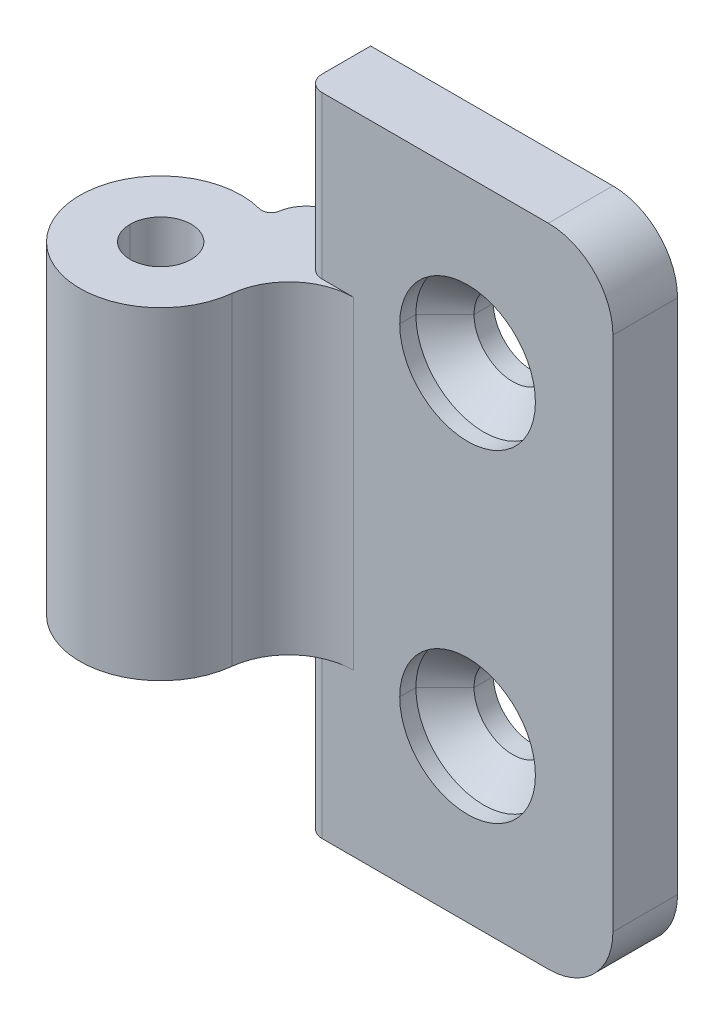
ISO-10303-21;
HEADER;
FILE_DESCRIPTION(('STEP AP214'),'2;1');
FILE_NAME('part.step','',(''),(''),'','','');
FILE_SCHEMA(('AUTOMOTIVE_DESIGN { 1 0 10303 214 1 1 1 1 }'));
ENDSEC;
DATA;
#1=APPLICATION_CONTEXT('core data for automotive mechanical design processes');
#2=APPLICATION_PROTOCOL_DEFINITION('international standard','automotive_design',2000,#1);
#3=PRODUCT_CONTEXT('',#1,'mechanical');
#4=PRODUCT('Part','Part','',(#3));
#5=PRODUCT_RELATED_PRODUCT_CATEGORY('part','',(#4));
#6=PRODUCT_DEFINITION_FORMATION('','',#4);
#7=PRODUCT_DEFINITION_CONTEXT('part definition',#1,'design');
#8=PRODUCT_DEFINITION('design','',#6,#7);
#9=PRODUCT_DEFINITION_SHAPE('','',#8);
#10=(LENGTH_UNIT() NAMED_UNIT(*) SI_UNIT(.MILLI.,.METRE.));
#11=(NAMED_UNIT(*) PLANE_ANGLE_UNIT() SI_UNIT($,.RADIAN.));
#12=(NAMED_UNIT(*) SI_UNIT($,.STERADIAN.) SOLID_ANGLE_UNIT());
#13=UNCERTAINTY_MEASURE_WITH_UNIT(LENGTH_MEASURE(1.E-05),#10,'distance_accuracy_value','');
#14=(GEOMETRIC_REPRESENTATION_CONTEXT(3) GLOBAL_UNCERTAINTY_ASSIGNED_CONTEXT((#13)) GLOBAL_UNIT_ASSIGNED_CONTEXT((#10,
#11,#12)) REPRESENTATION_CONTEXT('',''));
#15=CARTESIAN_POINT('',(0.,0.,0.));
#16=DIRECTION('',(0.,0.,1.));
#17=DIRECTION('',(1.,0.,0.));
#18=AXIS2_PLACEMENT_3D('',#15,#16,#17);
#19=CARTESIAN_POINT('',(8.,-5.,0.));
#20=DIRECTION('',(0.,0.,1.));
#21=DIRECTION('',(1.,0.,0.));
#22=AXIS2_PLACEMENT_3D('',#19,#20,#21);
#23=CYLINDRICAL_SURFACE('',#22,1.2);
#24=DIRECTION('',(0.,0.,1.));
#25=VECTOR('',#24,1.);
#26=CARTESIAN_POINT('',(6.8,-5.,0.));
#27=LINE('',#26,#25);
#28=CARTESIAN_POINT('',(6.8,-5.,0.));
#29=VERTEX_POINT('',#28);
#30=CARTESIAN_POINT('',(6.8,-5.,0.600000000000045));
#31=VERTEX_POINT('',#30);
#32=EDGE_CURVE('E304',#29,#31,#27,.T.);
#33=ORIENTED_EDGE('',*,*,#32,.F.);
#34=CARTESIAN_POINT('',(8.,-5.,0.));
#35=DIRECTION('',(0.,0.,-1.));
#36=DIRECTION('',(1.,0.,0.));
#37=AXIS2_PLACEMENT_3D('',#34,#35,#36);
#38=CIRCLE('',#37,1.2);
#39=CARTESIAN_POINT('',(9.2,-5.,0.));
#40=VERTEX_POINT('',#39);
#41=EDGE_CURVE('E28',#29,#40,#38,.T.);
#42=ORIENTED_EDGE('',*,*,#41,.T.);
#43=DIRECTION('',(0.,0.,1.));
#44=VECTOR('',#43,1.);
#45=CARTESIAN_POINT('',(9.2,-5.,0.));
#46=LINE('',#45,#44);
#47=CARTESIAN_POINT('',(9.2,-5.,0.6));
#48=VERTEX_POINT('',#47);
#49=EDGE_CURVE('E308',#40,#48,#46,.T.);
#50=ORIENTED_EDGE('',*,*,#49,.T.);
#51=CARTESIAN_POINT('',(8.,-5.,0.600000000000045));
#52=DIRECTION('',(0.,0.,-1.));
#53=DIRECTION('',(1.,0.,0.));
#54=AXIS2_PLACEMENT_3D('',#51,#52,#53);
#55=CIRCLE('',#54,1.2);
#56=EDGE_CURVE('E537',#31,#48,#55,.T.);
#57=ORIENTED_EDGE('',*,*,#56,.F.);
#58=EDGE_LOOP('',(#33,#42,#50,#57));
#59=FACE_BOUND('',#58,.T.);
#60=ADVANCED_FACE('F17',(#59),#23,.F.);
#61=CARTESIAN_POINT('',(8.,5.,0.));
#62=DIRECTION('',(0.,0.,1.));
#63=DIRECTION('',(1.,0.,0.));
#64=AXIS2_PLACEMENT_3D('',#61,#62,#63);
#65=CYLINDRICAL_SURFACE('',#64,1.2);
#66=DIRECTION('',(0.,0.,1.));
#67=VECTOR('',#66,1.);
#68=CARTESIAN_POINT('',(6.8,5.,0.));
#69=LINE('',#68,#67);
#70=CARTESIAN_POINT('',(6.8,5.,0.));
#71=VERTEX_POINT('',#70);
#72=CARTESIAN_POINT('',(6.8,5.,0.600000000000045));
#73=VERTEX_POINT('',#72);
#74=EDGE_CURVE('E466',#71,#73,#69,.T.);
#75=ORIENTED_EDGE('',*,*,#74,.F.);
#76=CARTESIAN_POINT('',(8.,5.,0.));
#77=DIRECTION('',(0.,0.,-1.));
#78=DIRECTION('',(1.,0.,0.));
#79=AXIS2_PLACEMENT_3D('',#76,#77,#78);
#80=CIRCLE('',#79,1.2);
#81=CARTESIAN_POINT('',(9.2,5.,0.));
#82=VERTEX_POINT('',#81);
#83=EDGE_CURVE('E11',#71,#82,#80,.T.);
#84=ORIENTED_EDGE('',*,*,#83,.T.);
#85=DIRECTION('',(0.,0.,1.));
#86=VECTOR('',#85,1.);
#87=CARTESIAN_POINT('',(9.2,5.,0.));
#88=LINE('',#87,#86);
#89=CARTESIAN_POINT('',(9.2,5.,0.6));
#90=VERTEX_POINT('',#89);
#91=EDGE_CURVE('E504',#82,#90,#88,.T.);
#92=ORIENTED_EDGE('',*,*,#91,.T.);
#93=CARTESIAN_POINT('',(8.,5.,0.600000000000045));
#94=DIRECTION('',(0.,0.,-1.));
#95=DIRECTION('',(1.,0.,0.));
#96=AXIS2_PLACEMENT_3D('',#93,#94,#95);
#97=CIRCLE('',#96,1.2);
#98=EDGE_CURVE('E296',#73,#90,#97,.T.);
#99=ORIENTED_EDGE('',*,*,#98,.F.);
#100=EDGE_LOOP('',(#75,#84,#92,#99));
#101=FACE_BOUND('',#100,.T.);
#102=ADVANCED_FACE('F804',(#101),#65,.F.);
#103=CARTESIAN_POINT('',(2.,5.,1.));
#104=DIRECTION('',(0.,-1.,0.));
#105=DIRECTION('',(1.,0.,0.));
#106=AXIS2_PLACEMENT_3D('',#103,#104,#105);
#107=CYLINDRICAL_SURFACE('',#106,1.);
#108=CARTESIAN_POINT('',(2.,-5.,1.));
#109=DIRECTION('',(0.,-1.,0.));
#110=DIRECTION('',(1.,0.,0.));
#111=AXIS2_PLACEMENT_3D('',#108,#109,#110);
#112=CIRCLE('',#111,1.);
#113=CARTESIAN_POINT('',(1.01272907012124,-5.,0.840952486873575));
#114=VERTEX_POINT('',#113);
#115=CARTESIAN_POINT('',(2.,-5.,0.));
#116=VERTEX_POINT('',#115);
#117=EDGE_CURVE('E377',#114,#116,#112,.T.);
#118=ORIENTED_EDGE('',*,*,#117,.F.);
#119=DIRECTION('',(0.,-1.,0.));
#120=VECTOR('',#119,1.);
#121=CARTESIAN_POINT('',(1.01272906992705,0.,0.84095248677326));
#122=LINE('',#121,#120);
#123=CARTESIAN_POINT('',(1.0127290699162,5.,0.840952486840546));
#124=VERTEX_POINT('',#123);
#125=EDGE_CURVE('E351',#124,#114,#122,.T.);
#126=ORIENTED_EDGE('',*,*,#125,.F.);
#127=CARTESIAN_POINT('',(2.,5.,1.));
#128=DIRECTION('',(0.,1.,0.));
#129=DIRECTION('',(1.,0.,0.));
#130=AXIS2_PLACEMENT_3D('',#127,#128,#129);
#131=CIRCLE('',#130,1.);
#132=CARTESIAN_POINT('',(2.,5.,0.));
#133=VERTEX_POINT('',#132);
#134=EDGE_CURVE('E263',#133,#124,#131,.T.);
#135=ORIENTED_EDGE('',*,*,#134,.F.);
#136=DIRECTION('',(0.,-1.,0.));
#137=VECTOR('',#136,1.);
#138=CARTESIAN_POINT('',(2.,0.,0.));
#139=LINE('',#138,#137);
#140=EDGE_CURVE('E543',#133,#116,#139,.T.);
#141=ORIENTED_EDGE('',*,*,#140,.T.);
#142=EDGE_LOOP('',(#118,#126,#135,#141));
#143=FACE_BOUND('',#142,.T.);
#144=ADVANCED_FACE('F799',(#143),#107,.T.);
#145=CARTESIAN_POINT('',(3.,-5.,0.));
#146=DIRECTION('',(-1.,0.,0.));
#147=DIRECTION('',(0.,0.,1.));
#148=AXIS2_PLACEMENT_3D('',#145,#146,#147);
#149=PLANE('',#148);
#150=DIRECTION('',(0.,0.,-1.));
#151=VECTOR('',#150,1.);
#152=CARTESIAN_POINT('',(3.,-5.,0.75));
#153=LINE('',#152,#151);
#154=CARTESIAN_POINT('',(3.,-5.,1.49999999989745));
#155=VERTEX_POINT('',#154);
#156=CARTESIAN_POINT('',(2.99999999833333,-5.,0.));
#157=VERTEX_POINT('',#156);
#158=EDGE_CURVE('E319',#155,#157,#153,.T.);
#159=ORIENTED_EDGE('',*,*,#158,.T.);
#160=DIRECTION('',(0.,-1.,0.));
#161=VECTOR('',#160,1.);
#162=CARTESIAN_POINT('',(2.99999999750001,0.,0.));
#163=LINE('',#162,#161);
#164=CARTESIAN_POINT('',(2.99999999916667,-10.,0.));
#165=VERTEX_POINT('',#164);
#166=EDGE_CURVE('E42',#157,#165,#163,.T.);
#167=ORIENTED_EDGE('',*,*,#166,.T.);
#168=DIRECTION('',(0.,0.,1.));
#169=VECTOR('',#168,1.);
#170=CARTESIAN_POINT('',(3.,-10.,0.75));
#171=LINE('',#170,#169);
#172=CARTESIAN_POINT('',(3.,-10.,1.49999999989745));
#173=VERTEX_POINT('',#172);
#174=EDGE_CURVE('E21',#165,#173,#171,.T.);
#175=ORIENTED_EDGE('',*,*,#174,.T.);
#176=DIRECTION('',(0.,1.,0.));
#177=VECTOR('',#176,1.);
#178=CARTESIAN_POINT('',(3.,-7.5,1.4999999997949));
#179=LINE('',#178,#177);
#180=EDGE_CURVE('E294',#173,#155,#179,.T.);
#181=ORIENTED_EDGE('',*,*,#180,.T.);
#182=EDGE_LOOP('',(#159,#167,#175,#181));
#183=FACE_BOUND('',#182,.T.);
#184=ADVANCED_FACE('F769',(#183),#149,.T.);
#185=CARTESIAN_POINT('',(2.,-10.,0.));
#186=DIRECTION('',(0.,0.,1.));
#187=DIRECTION('',(1.,0.,0.));
#188=AXIS2_PLACEMENT_3D('',#185,#186,#187);
#189=PLANE('',#188);
#190=CARTESIAN_POINT('',(8.,5.,0.));
#191=DIRECTION('',(0.,0.,-1.));
#192=DIRECTION('',(1.,0.,0.));
#193=AXIS2_PLACEMENT_3D('',#190,#191,#192);
#194=CIRCLE('',#193,1.2);
#195=EDGE_CURVE('E367',#82,#71,#194,.T.);
#196=ORIENTED_EDGE('',*,*,#195,.F.);
#197=ORIENTED_EDGE('',*,*,#83,.F.);
#198=EDGE_LOOP('',(#196,#197));
#199=FACE_BOUND('',#198,.T.);
#200=CARTESIAN_POINT('',(8.,-5.,0.));
#201=DIRECTION('',(0.,0.,-1.));
#202=DIRECTION('',(1.,0.,0.));
#203=AXIS2_PLACEMENT_3D('',#200,#201,#202);
#204=CIRCLE('',#203,1.2);
#205=EDGE_CURVE('E309',#40,#29,#204,.T.);
#206=ORIENTED_EDGE('',*,*,#205,.F.);
#207=ORIENTED_EDGE('',*,*,#41,.F.);
#208=EDGE_LOOP('',(#206,#207));
#209=FACE_BOUND('',#208,.T.);
#210=ORIENTED_EDGE('',*,*,#140,.F.);
#211=DIRECTION('',(-1.,0.,0.));
#212=VECTOR('',#211,1.);
#213=CARTESIAN_POINT('',(7.25,5.,0.));
#214=LINE('',#213,#212);
#215=CARTESIAN_POINT('',(3.,5.,0.));
#216=VERTEX_POINT('',#215);
#217=EDGE_CURVE('E434',#216,#133,#214,.T.);
#218=ORIENTED_EDGE('',*,*,#217,.F.);
#219=DIRECTION('',(0.,-1.,0.));
#220=VECTOR('',#219,1.);
#221=CARTESIAN_POINT('',(3.,7.5,0.));
#222=LINE('',#221,#220);
#223=CARTESIAN_POINT('',(3.,10.,0.));
#224=VERTEX_POINT('',#223);
#225=EDGE_CURVE('E540',#224,#216,#222,.T.);
#226=ORIENTED_EDGE('',*,*,#225,.F.);
#227=DIRECTION('',(1.,0.,0.));
#228=VECTOR('',#227,1.);
#229=CARTESIAN_POINT('',(6.75,10.,0.));
#230=LINE('',#229,#228);
#231=CARTESIAN_POINT('',(10.5,10.,0.));
#232=VERTEX_POINT('',#231);
#233=EDGE_CURVE('E358',#224,#232,#230,.T.);
#234=ORIENTED_EDGE('',*,*,#233,.T.);
#235=CARTESIAN_POINT('',(10.5,8.,0.));
#236=DIRECTION('',(0.,0.,-1.));
#237=DIRECTION('',(-1.,0.,0.));
#238=AXIS2_PLACEMENT_3D('',#235,#236,#237);
#239=CIRCLE('',#238,2.);
#240=CARTESIAN_POINT('',(12.5,7.9999999995898,0.));
#241=VERTEX_POINT('',#240);
#242=EDGE_CURVE('E393',#232,#241,#239,.T.);
#243=ORIENTED_EDGE('',*,*,#242,.T.);
#244=DIRECTION('',(0.,-1.,0.));
#245=VECTOR('',#244,1.);
#246=CARTESIAN_POINT('',(12.5,0.,0.));
#247=LINE('',#246,#245);
#248=CARTESIAN_POINT('',(12.5,-8.,0.));
#249=VERTEX_POINT('',#248);
#250=EDGE_CURVE('E410',#241,#249,#247,.T.);
#251=ORIENTED_EDGE('',*,*,#250,.T.);
#252=CARTESIAN_POINT('',(10.5,-8.,0.));
#253=DIRECTION('',(0.,0.,-1.));
#254=DIRECTION('',(-1.,0.,0.));
#255=AXIS2_PLACEMENT_3D('',#252,#253,#254);
#256=CIRCLE('',#255,2.);
#257=CARTESIAN_POINT('',(10.5000000003847,-10.,0.));
#258=VERTEX_POINT('',#257);
#259=EDGE_CURVE('E418',#249,#258,#256,.T.);
#260=ORIENTED_EDGE('',*,*,#259,.T.);
#261=DIRECTION('',(-1.,0.,0.));
#262=VECTOR('',#261,1.);
#263=CARTESIAN_POINT('',(6.75,-10.,0.));
#264=LINE('',#263,#262);
#265=EDGE_CURVE('E297',#258,#165,#264,.T.);
#266=ORIENTED_EDGE('',*,*,#265,.T.);
#267=ORIENTED_EDGE('',*,*,#166,.F.);
#268=DIRECTION('',(1.,0.,0.));
#269=VECTOR('',#268,1.);
#270=CARTESIAN_POINT('',(7.25,-5.,0.));
#271=LINE('',#270,#269);
#272=EDGE_CURVE('E392',#116,#157,#271,.T.);
#273=ORIENTED_EDGE('',*,*,#272,.F.);
#274=EDGE_LOOP('',(#210,#218,#226,#234,#243,#251,#260,#266,#267,#273));
#275=FACE_BOUND('',#274,.T.);
#276=ADVANCED_FACE('F764',(#199,#209,#275),#189,.F.);
#277=CARTESIAN_POINT('',(3.,10.,0.));
#278=DIRECTION('',(-1.,0.,0.));
#279=DIRECTION('',(0.,0.,1.));
#280=AXIS2_PLACEMENT_3D('',#277,#278,#279);
#281=PLANE('',#280);
#282=DIRECTION('',(0.,0.,-1.));
#283=VECTOR('',#282,1.);
#284=CARTESIAN_POINT('',(3.,10.,1.));
#285=LINE('',#284,#283);
#286=CARTESIAN_POINT('',(3.,10.,1.5));
#287=VERTEX_POINT('',#286);
#288=EDGE_CURVE('E353',#287,#224,#285,.T.);
#289=ORIENTED_EDGE('',*,*,#288,.T.);
#290=ORIENTED_EDGE('',*,*,#225,.T.);
#291=DIRECTION('',(0.,0.,1.));
#292=VECTOR('',#291,1.);
#293=CARTESIAN_POINT('',(3.,5.,0.75));
#294=LINE('',#293,#292);
#295=CARTESIAN_POINT('',(3.,5.,1.5));
#296=VERTEX_POINT('',#295);
#297=EDGE_CURVE('E343',#216,#296,#294,.T.);
#298=ORIENTED_EDGE('',*,*,#297,.T.);
#299=DIRECTION('',(0.,1.,0.));
#300=VECTOR('',#299,1.);
#301=CARTESIAN_POINT('',(3.,7.5,1.5));
#302=LINE('',#301,#300);
#303=EDGE_CURVE('E368',#296,#287,#302,.T.);
#304=ORIENTED_EDGE('',*,*,#303,.T.);
#305=EDGE_LOOP('',(#289,#290,#298,#304));
#306=FACE_BOUND('',#305,.T.);
#307=ADVANCED_FACE('F768',(#306),#281,.T.);
#308=CARTESIAN_POINT('',(8.,-5.,0.6));
#309=DIRECTION('',(0.,0.,1.));
#310=DIRECTION('',(1.,0.,0.));
#311=AXIS2_PLACEMENT_3D('',#308,#309,#310);
#312=CONICAL_SURFACE('',#311,1.2,0.785398163397448);
#313=DIRECTION('',(-0.707106781186548,0.,0.707106781186548));
#314=VECTOR('',#313,1.);
#315=CARTESIAN_POINT('',(6.8,-5.,0.6));
#316=LINE('',#315,#314);
#317=CARTESIAN_POINT('',(5.9,-5.,1.5));
#318=VERTEX_POINT('',#317);
#319=EDGE_CURVE('E332',#31,#318,#316,.T.);
#320=ORIENTED_EDGE('',*,*,#319,.F.);
#321=ORIENTED_EDGE('',*,*,#56,.T.);
#322=DIRECTION('',(0.707106781186548,0.,0.707106781186548));
#323=VECTOR('',#322,1.);
#324=CARTESIAN_POINT('',(9.2,-5.,0.6));
#325=LINE('',#324,#323);
#326=CARTESIAN_POINT('',(10.1,-5.,1.5));
#327=VERTEX_POINT('',#326);
#328=EDGE_CURVE('E336',#48,#327,#325,.T.);
#329=ORIENTED_EDGE('',*,*,#328,.T.);
#330=CARTESIAN_POINT('',(8.,-5.,1.5));
#331=DIRECTION('',(0.,0.,-1.));
#332=DIRECTION('',(1.,0.,0.));
#333=AXIS2_PLACEMENT_3D('',#330,#331,#332);
#334=CIRCLE('',#333,2.1);
#335=EDGE_CURVE('E359',#318,#327,#334,.T.);
#336=ORIENTED_EDGE('',*,*,#335,.F.);
#337=EDGE_LOOP('',(#320,#321,#329,#336));
#338=FACE_BOUND('',#337,.T.);
#339=ADVANCED_FACE('F790',(#338),#312,.F.);
#340=CARTESIAN_POINT('',(8.,5.,0.6));
#341=DIRECTION('',(0.,0.,1.));
#342=DIRECTION('',(1.,0.,0.));
#343=AXIS2_PLACEMENT_3D('',#340,#341,#342);
#344=CONICAL_SURFACE('',#343,1.2,0.785398163397448);
#345=DIRECTION('',(-0.707106781186548,0.,0.707106781186548));
#346=VECTOR('',#345,1.);
#347=CARTESIAN_POINT('',(6.8,5.,0.6));
#348=LINE('',#347,#346);
#349=CARTESIAN_POINT('',(5.9,5.,1.5));
#350=VERTEX_POINT('',#349);
#351=EDGE_CURVE('E421',#73,#350,#348,.T.);
#352=ORIENTED_EDGE('',*,*,#351,.F.);
#353=ORIENTED_EDGE('',*,*,#98,.T.);
#354=DIRECTION('',(0.707106781186548,0.,0.707106781186548));
#355=VECTOR('',#354,1.);
#356=CARTESIAN_POINT('',(9.2,5.,0.6));
#357=LINE('',#356,#355);
#358=CARTESIAN_POINT('',(10.1,5.,1.5));
#359=VERTEX_POINT('',#358);
#360=EDGE_CURVE('E425',#90,#359,#357,.T.);
#361=ORIENTED_EDGE('',*,*,#360,.T.);
#362=CARTESIAN_POINT('',(8.,5.,1.5));
#363=DIRECTION('',(0.,0.,-1.));
#364=DIRECTION('',(1.,0.,0.));
#365=AXIS2_PLACEMENT_3D('',#362,#363,#364);
#366=CIRCLE('',#365,2.1);
#367=EDGE_CURVE('E363',#350,#359,#366,.T.);
#368=ORIENTED_EDGE('',*,*,#367,.F.);
#369=EDGE_LOOP('',(#352,#353,#361,#368));
#370=FACE_BOUND('',#369,.T.);
#371=ADVANCED_FACE('F786',(#370),#344,.F.);
#372=CARTESIAN_POINT('',(3.5,-5.,1.5));
#373=DIRECTION('',(0.,-1.,0.));
#374=DIRECTION('',(0.,0.,-1.));
#375=AXIS2_PLACEMENT_3D('',#372,#373,#374);
#376=CYLINDRICAL_SURFACE('',#375,0.5);
#377=ORIENTED_EDGE('',*,*,#180,.F.);
#378=CARTESIAN_POINT('',(3.5,-10.,1.5));
#379=DIRECTION('',(0.,1.,0.));
#380=DIRECTION('',(0.,0.,-1.));
#381=AXIS2_PLACEMENT_3D('',#378,#379,#380);
#382=CIRCLE('',#381,0.5);
#383=CARTESIAN_POINT('',(3.5,-10.,2.));
#384=VERTEX_POINT('',#383);
#385=EDGE_CURVE('E415',#173,#384,#382,.T.);
#386=ORIENTED_EDGE('',*,*,#385,.T.);
#387=DIRECTION('',(0.,-1.,0.));
#388=VECTOR('',#387,1.);
#389=CARTESIAN_POINT('',(3.5,0.,2.));
#390=LINE('',#389,#388);
#391=CARTESIAN_POINT('',(3.5,-5.,2.));
#392=VERTEX_POINT('',#391);
#393=EDGE_CURVE('E338',#392,#384,#390,.T.);
#394=ORIENTED_EDGE('',*,*,#393,.F.);
#395=CARTESIAN_POINT('',(3.5,-5.,1.5));
#396=DIRECTION('',(0.,1.,0.));
#397=DIRECTION('',(0.,0.,-1.));
#398=AXIS2_PLACEMENT_3D('',#395,#396,#397);
#399=CIRCLE('',#398,0.5);
#400=EDGE_CURVE('E315',#155,#392,#399,.T.);
#401=ORIENTED_EDGE('',*,*,#400,.F.);
#402=EDGE_LOOP('',(#377,#386,#394,#401));
#403=FACE_BOUND('',#402,.T.);
#404=ADVANCED_FACE('F739',(#403),#376,.T.);
#405=CARTESIAN_POINT('',(3.,-10.,0.));
#406=DIRECTION('',(0.,1.,0.));
#407=DIRECTION('',(1.,0.,0.));
#408=AXIS2_PLACEMENT_3D('',#405,#406,#407);
#409=PLANE('',#408);
#410=ORIENTED_EDGE('',*,*,#385,.F.);
#411=ORIENTED_EDGE('',*,*,#174,.F.);
#412=ORIENTED_EDGE('',*,*,#265,.F.);
#413=DIRECTION('',(0.,0.,1.));
#414=VECTOR('',#413,1.);
#415=CARTESIAN_POINT('',(10.5000000007694,-10.,1.));
#416=LINE('',#415,#414);
#417=CARTESIAN_POINT('',(10.5000000003847,-10.,2.));
#418=VERTEX_POINT('',#417);
#419=EDGE_CURVE('E414',#258,#418,#416,.T.);
#420=ORIENTED_EDGE('',*,*,#419,.T.);
#421=DIRECTION('',(1.,0.,0.));
#422=VECTOR('',#421,1.);
#423=CARTESIAN_POINT('',(8.,-10.,2.));
#424=LINE('',#423,#422);
#425=EDGE_CURVE('E342',#384,#418,#424,.T.);
#426=ORIENTED_EDGE('',*,*,#425,.F.);
#427=EDGE_LOOP('',(#410,#411,#412,#420,#426));
#428=FACE_BOUND('',#427,.T.);
#429=ADVANCED_FACE('F734',(#428),#409,.F.);
#430=CARTESIAN_POINT('',(10.5,-8.,2.));
#431=DIRECTION('',(0.,0.,-1.));
#432=DIRECTION('',(-1.,0.,0.));
#433=AXIS2_PLACEMENT_3D('',#430,#431,#432);
#434=CYLINDRICAL_SURFACE('',#433,2.);
#435=ORIENTED_EDGE('',*,*,#419,.F.);
#436=ORIENTED_EDGE('',*,*,#259,.F.);
#437=DIRECTION('',(0.,0.,1.));
#438=VECTOR('',#437,1.);
#439=CARTESIAN_POINT('',(12.5,-8.,1.));
#440=LINE('',#439,#438);
#441=CARTESIAN_POINT('',(12.5,-8.,2.));
#442=VERTEX_POINT('',#441);
#443=EDGE_CURVE('E397',#249,#442,#440,.T.);
#444=ORIENTED_EDGE('',*,*,#443,.T.);
#445=CARTESIAN_POINT('',(10.5,-8.,2.));
#446=DIRECTION('',(0.,0.,1.));
#447=DIRECTION('',(-1.,0.,0.));
#448=AXIS2_PLACEMENT_3D('',#445,#446,#447);
#449=CIRCLE('',#448,2.);
#450=EDGE_CURVE('E409',#418,#442,#449,.T.);
#451=ORIENTED_EDGE('',*,*,#450,.F.);
#452=EDGE_LOOP('',(#435,#436,#444,#451));
#453=FACE_BOUND('',#452,.T.);
#454=ADVANCED_FACE('F738',(#453),#434,.T.);
#455=CARTESIAN_POINT('',(12.5,8.,0.));
#456=DIRECTION('',(-1.,0.,0.));
#457=DIRECTION('',(0.,0.,1.));
#458=AXIS2_PLACEMENT_3D('',#455,#456,#457);
#459=PLANE('',#458);
#460=DIRECTION('',(0.,0.,1.));
#461=VECTOR('',#460,1.);
#462=CARTESIAN_POINT('',(12.5,7.99999999917959,1.));
#463=LINE('',#462,#461);
#464=CARTESIAN_POINT('',(12.5,7.9999999995898,2.));
#465=VERTEX_POINT('',#464);
#466=EDGE_CURVE('E357',#241,#465,#463,.T.);
#467=ORIENTED_EDGE('',*,*,#466,.T.);
#468=DIRECTION('',(0.,1.,0.));
#469=VECTOR('',#468,1.);
#470=CARTESIAN_POINT('',(12.5,0.,2.));
#471=LINE('',#470,#469);
#472=EDGE_CURVE('E470',#442,#465,#471,.T.);
#473=ORIENTED_EDGE('',*,*,#472,.F.);
#474=ORIENTED_EDGE('',*,*,#443,.F.);
#475=ORIENTED_EDGE('',*,*,#250,.F.);
#476=EDGE_LOOP('',(#467,#473,#474,#475));
#477=FACE_BOUND('',#476,.T.);
#478=ADVANCED_FACE('F880',(#477),#459,.F.);
#479=CARTESIAN_POINT('',(10.5,8.,2.));
#480=DIRECTION('',(0.,0.,-1.));
#481=DIRECTION('',(-1.,0.,0.));
#482=AXIS2_PLACEMENT_3D('',#479,#480,#481);
#483=CYLINDRICAL_SURFACE('',#482,2.);
#484=ORIENTED_EDGE('',*,*,#466,.F.);
#485=ORIENTED_EDGE('',*,*,#242,.F.);
#486=DIRECTION('',(0.,0.,1.));
#487=VECTOR('',#486,1.);
#488=CARTESIAN_POINT('',(10.5,10.,1.));
#489=LINE('',#488,#487);
#490=CARTESIAN_POINT('',(10.5,10.,2.));
#491=VERTEX_POINT('',#490);
#492=EDGE_CURVE('E372',#232,#491,#489,.T.);
#493=ORIENTED_EDGE('',*,*,#492,.T.);
#494=CARTESIAN_POINT('',(10.5,8.,2.));
#495=DIRECTION('',(0.,0.,1.));
#496=DIRECTION('',(-1.,0.,0.));
#497=AXIS2_PLACEMENT_3D('',#494,#495,#496);
#498=CIRCLE('',#497,2.);
#499=EDGE_CURVE('E474',#465,#491,#498,.T.);
#500=ORIENTED_EDGE('',*,*,#499,.F.);
#501=EDGE_LOOP('',(#484,#485,#493,#500));
#502=FACE_BOUND('',#501,.T.);
#503=ADVANCED_FACE('F930',(#502),#483,.T.);
#504=CARTESIAN_POINT('',(3.,10.,2.));
#505=DIRECTION('',(0.,-1.,0.));
#506=DIRECTION('',(0.,0.,-1.));
#507=AXIS2_PLACEMENT_3D('',#504,#505,#506);
#508=PLANE('',#507);
#509=CARTESIAN_POINT('',(3.5,10.,1.5));
#510=DIRECTION('',(0.,1.,0.));
#511=DIRECTION('',(0.,0.,1.));
#512=AXIS2_PLACEMENT_3D('',#509,#510,#511);
#513=CIRCLE('',#512,0.5);
#514=CARTESIAN_POINT('',(3.5,10.,2.));
#515=VERTEX_POINT('',#514);
#516=EDGE_CURVE('E362',#287,#515,#513,.T.);
#517=ORIENTED_EDGE('',*,*,#516,.T.);
#518=DIRECTION('',(-1.,0.,0.));
#519=VECTOR('',#518,1.);
#520=CARTESIAN_POINT('',(8.,10.,2.));
#521=LINE('',#520,#519);
#522=EDGE_CURVE('E480',#491,#515,#521,.T.);
#523=ORIENTED_EDGE('',*,*,#522,.F.);
#524=ORIENTED_EDGE('',*,*,#492,.F.);
#525=ORIENTED_EDGE('',*,*,#233,.F.);
#526=ORIENTED_EDGE('',*,*,#288,.F.);
#527=EDGE_LOOP('',(#517,#523,#524,#525,#526));
#528=FACE_BOUND('',#527,.T.);
#529=ADVANCED_FACE('F847',(#528),#508,.F.);
#530=CARTESIAN_POINT('',(3.5,5.,1.5));
#531=DIRECTION('',(0.,1.,0.));
#532=DIRECTION('',(0.,0.,1.));
#533=AXIS2_PLACEMENT_3D('',#530,#531,#532);
#534=CYLINDRICAL_SURFACE('',#533,0.5);
#535=DIRECTION('',(0.,-1.,0.));
#536=VECTOR('',#535,1.);
#537=CARTESIAN_POINT('',(3.5,0.,2.));
#538=LINE('',#537,#536);
#539=CARTESIAN_POINT('',(3.5,5.,2.000000000716));
#540=VERTEX_POINT('',#539);
#541=EDGE_CURVE('E478',#515,#540,#538,.T.);
#542=ORIENTED_EDGE('',*,*,#541,.F.);
#543=ORIENTED_EDGE('',*,*,#516,.F.);
#544=ORIENTED_EDGE('',*,*,#303,.F.);
#545=CARTESIAN_POINT('',(3.5,5.,1.5));
#546=DIRECTION('',(0.,-1.,0.));
#547=DIRECTION('',(0.,0.,1.));
#548=AXIS2_PLACEMENT_3D('',#545,#546,#547);
#549=CIRCLE('',#548,0.5);
#550=EDGE_CURVE('E520',#540,#296,#549,.T.);
#551=ORIENTED_EDGE('',*,*,#550,.F.);
#552=EDGE_LOOP('',(#542,#543,#544,#551));
#553=FACE_BOUND('',#552,.T.);
#554=ADVANCED_FACE('F842',(#553),#534,.T.);
#555=CARTESIAN_POINT('',(8.,-5.,1.5));
#556=DIRECTION('',(0.,0.,1.));
#557=DIRECTION('',(1.,0.,0.));
#558=AXIS2_PLACEMENT_3D('',#555,#556,#557);
#559=CYLINDRICAL_SURFACE('',#558,2.1);
#560=DIRECTION('',(0.,0.,1.));
#561=VECTOR('',#560,1.);
#562=CARTESIAN_POINT('',(5.9,-5.,1.5));
#563=LINE('',#562,#561);
#564=CARTESIAN_POINT('',(5.9,-5.,2.));
#565=VERTEX_POINT('',#564);
#566=EDGE_CURVE('E442',#318,#565,#563,.T.);
#567=ORIENTED_EDGE('',*,*,#566,.F.);
#568=ORIENTED_EDGE('',*,*,#335,.T.);
#569=DIRECTION('',(0.,0.,1.));
#570=VECTOR('',#569,1.);
#571=CARTESIAN_POINT('',(10.1,-5.,1.5));
#572=LINE('',#571,#570);
#573=CARTESIAN_POINT('',(10.1,-5.,2.));
#574=VERTEX_POINT('',#573);
#575=EDGE_CURVE('E326',#327,#574,#572,.T.);
#576=ORIENTED_EDGE('',*,*,#575,.T.);
#577=CARTESIAN_POINT('',(8.,-5.,2.));
#578=DIRECTION('',(0.,0.,-1.));
#579=DIRECTION('',(1.,0.,0.));
#580=AXIS2_PLACEMENT_3D('',#577,#578,#579);
#581=CIRCLE('',#580,2.1);
#582=EDGE_CURVE('E348',#565,#574,#581,.T.);
#583=ORIENTED_EDGE('',*,*,#582,.F.);
#584=EDGE_LOOP('',(#567,#568,#576,#583));
#585=FACE_BOUND('',#584,.T.);
#586=ADVANCED_FACE('F846',(#585),#559,.F.);
#587=CARTESIAN_POINT('',(8.,5.,1.5));
#588=DIRECTION('',(0.,0.,1.));
#589=DIRECTION('',(1.,0.,0.));
#590=AXIS2_PLACEMENT_3D('',#587,#588,#589);
#591=CYLINDRICAL_SURFACE('',#590,2.1);
#592=DIRECTION('',(0.,0.,1.));
#593=VECTOR('',#592,1.);
#594=CARTESIAN_POINT('',(5.9,5.,1.5));
#595=LINE('',#594,#593);
#596=CARTESIAN_POINT('',(5.9,5.,2.));
#597=VERTEX_POINT('',#596);
#598=EDGE_CURVE('E388',#350,#597,#595,.T.);
#599=ORIENTED_EDGE('',*,*,#598,.F.);
#600=ORIENTED_EDGE('',*,*,#367,.T.);
#601=DIRECTION('',(0.,0.,1.));
#602=VECTOR('',#601,1.);
#603=CARTESIAN_POINT('',(10.1,5.,1.5));
#604=LINE('',#603,#602);
#605=CARTESIAN_POINT('',(10.1,5.,2.));
#606=VERTEX_POINT('',#605);
#607=EDGE_CURVE('E292',#359,#606,#604,.T.);
#608=ORIENTED_EDGE('',*,*,#607,.T.);
#609=CARTESIAN_POINT('',(8.,5.,2.));
#610=DIRECTION('',(0.,0.,-1.));
#611=DIRECTION('',(1.,0.,0.));
#612=AXIS2_PLACEMENT_3D('',#609,#610,#611);
#613=CIRCLE('',#612,2.1);
#614=EDGE_CURVE('E352',#597,#606,#613,.T.);
#615=ORIENTED_EDGE('',*,*,#614,.F.);
#616=EDGE_LOOP('',(#599,#600,#608,#615));
#617=FACE_BOUND('',#616,.T.);
#618=ADVANCED_FACE('F936',(#617),#591,.F.);
#619=CARTESIAN_POINT('',(0.716547791,-5.,0.793238232999999));
#620=DIRECTION('',(0.,1.,0.));
#621=DIRECTION('',(-1.,0.,0.));
#622=AXIS2_PLACEMENT_3D('',#619,#620,#621);
#623=CYLINDRICAL_SURFACE('',#622,0.3);
#624=DIRECTION('',(0.,1.,0.));
#625=VECTOR('',#624,1.);
#626=CARTESIAN_POINT('',(0.639774813090251,0.,1.0832484222545));
#627=LINE('',#626,#625);
#628=CARTESIAN_POINT('',(0.639774813241748,-5.,1.08324842228723));
#629=VERTEX_POINT('',#628);
#630=CARTESIAN_POINT('',(0.639774813241741,5.,1.08324842228723));
#631=VERTEX_POINT('',#630);
#632=EDGE_CURVE('E269',#629,#631,#627,.T.);
#633=ORIENTED_EDGE('',*,*,#632,.T.);
#634=CARTESIAN_POINT('',(0.716547790999986,5.,0.793238232999999));
#635=DIRECTION('',(0.,1.,0.));
#636=DIRECTION('',(-1.,0.,0.));
#637=AXIS2_PLACEMENT_3D('',#634,#635,#636);
#638=CIRCLE('',#637,0.3);
#639=EDGE_CURVE('E255',#631,#124,#638,.T.);
#640=ORIENTED_EDGE('',*,*,#639,.T.);
#641=ORIENTED_EDGE('',*,*,#125,.T.);
#642=CARTESIAN_POINT('',(0.716547791,-5.,0.793238232999999));
#643=DIRECTION('',(0.,-1.,0.));
#644=DIRECTION('',(-1.,0.,0.));
#645=AXIS2_PLACEMENT_3D('',#642,#643,#644);
#646=CIRCLE('',#645,0.3);
#647=EDGE_CURVE('E272',#114,#629,#646,.T.);
#648=ORIENTED_EDGE('',*,*,#647,.T.);
#649=EDGE_LOOP('',(#633,#640,#641,#648));
#650=FACE_BOUND('',#649,.T.);
#651=ADVANCED_FACE('F270',(#650),#623,.F.);
#652=CARTESIAN_POINT('',(3.5,-10.,2.));
#653=DIRECTION('',(0.,0.,1.));
#654=DIRECTION('',(1.,0.,0.));
#655=AXIS2_PLACEMENT_3D('',#652,#653,#654);
#656=PLANE('',#655);
#657=CARTESIAN_POINT('',(8.,-5.,2.));
#658=DIRECTION('',(0.,0.,-1.));
#659=DIRECTION('',(1.,0.,0.));
#660=AXIS2_PLACEMENT_3D('',#657,#658,#659);
#661=CIRCLE('',#660,2.1);
#662=EDGE_CURVE('E331',#574,#565,#661,.T.);
#663=ORIENTED_EDGE('',*,*,#662,.T.);
#664=ORIENTED_EDGE('',*,*,#582,.T.);
#665=EDGE_LOOP('',(#663,#664));
#666=FACE_BOUND('',#665,.T.);
#667=CARTESIAN_POINT('',(8.,5.,2.));
#668=DIRECTION('',(0.,0.,-1.));
#669=DIRECTION('',(1.,0.,0.));
#670=AXIS2_PLACEMENT_3D('',#667,#668,#669);
#671=CIRCLE('',#670,2.1);
#672=EDGE_CURVE('E384',#606,#597,#671,.T.);
#673=ORIENTED_EDGE('',*,*,#672,.T.);
#674=ORIENTED_EDGE('',*,*,#614,.T.);
#675=EDGE_LOOP('',(#673,#674));
#676=FACE_BOUND('',#675,.T.);
#677=DIRECTION('',(1.,0.,0.));
#678=VECTOR('',#677,1.);
#679=CARTESIAN_POINT('',(0.986067977499998,5.,2.000000001432));
#680=LINE('',#679,#678);
#681=CARTESIAN_POINT('',(4.47213595482041,5.,2.000000000716));
#682=VERTEX_POINT('',#681);
#683=EDGE_CURVE('E266',#540,#682,#680,.T.);
#684=ORIENTED_EDGE('',*,*,#683,.T.);
#685=DIRECTION('',(0.,1.,0.));
#686=VECTOR('',#685,1.);
#687=CARTESIAN_POINT('',(4.47213595464082,0.,2.));
#688=LINE('',#687,#686);
#689=CARTESIAN_POINT('',(4.47213595482041,-5.,2.));
#690=VERTEX_POINT('',#689);
#691=EDGE_CURVE('E310',#690,#682,#688,.T.);
#692=ORIENTED_EDGE('',*,*,#691,.F.);
#693=DIRECTION('',(-1.,0.,0.));
#694=VECTOR('',#693,1.);
#695=CARTESIAN_POINT('',(8.,-5.,2.));
#696=LINE('',#695,#694);
#697=EDGE_CURVE('E318',#690,#392,#696,.T.);
#698=ORIENTED_EDGE('',*,*,#697,.T.);
#699=ORIENTED_EDGE('',*,*,#393,.T.);
#700=ORIENTED_EDGE('',*,*,#425,.T.);
#701=ORIENTED_EDGE('',*,*,#450,.T.);
#702=ORIENTED_EDGE('',*,*,#472,.T.);
#703=ORIENTED_EDGE('',*,*,#499,.T.);
#704=ORIENTED_EDGE('',*,*,#522,.T.);
#705=ORIENTED_EDGE('',*,*,#541,.T.);
#706=EDGE_LOOP('',(#684,#692,#698,#699,#700,#701,#702,#703,#704,#705));
#707=FACE_BOUND('',#706,.T.);
#708=ADVANCED_FACE('F886',(#666,#676,#707),#656,.T.);
#709=CARTESIAN_POINT('',(-2.541832816,5.,6.036));
#710=DIRECTION('',(0.,-1.,0.));
#711=DIRECTION('',(0.,0.,-1.));
#712=AXIS2_PLACEMENT_3D('',#709,#710,#711);
#713=PLANE('',#712);
#714=CARTESIAN_POINT('',(0.,5.,3.5));
#715=DIRECTION('',(0.,1.,0.));
#716=DIRECTION('',(1.,0.,0.));
#717=AXIS2_PLACEMENT_3D('',#714,#715,#716);
#718=CIRCLE('',#717,0.945);
#719=CARTESIAN_POINT('',(0.945,5.,3.5));
#720=VERTEX_POINT('',#719);
#721=CARTESIAN_POINT('',(-0.945,5.,3.5));
#722=VERTEX_POINT('',#721);
#723=EDGE_CURVE('E441',#720,#722,#718,.T.);
#724=ORIENTED_EDGE('',*,*,#723,.F.);
#725=CARTESIAN_POINT('',(0.,5.,3.5));
#726=DIRECTION('',(0.,1.,0.));
#727=DIRECTION('',(1.,0.,0.));
#728=AXIS2_PLACEMENT_3D('',#725,#726,#727);
#729=CIRCLE('',#728,0.945);
#730=EDGE_CURVE('E281',#722,#720,#729,.T.);
#731=ORIENTED_EDGE('',*,*,#730,.F.);
#732=EDGE_LOOP('',(#724,#731));
#733=FACE_BOUND('',#732,.T.);
#734=ORIENTED_EDGE('',*,*,#217,.T.);
#735=ORIENTED_EDGE('',*,*,#134,.T.);
#736=ORIENTED_EDGE('',*,*,#639,.F.);
#737=CARTESIAN_POINT('',(0.,5.,3.5));
#738=DIRECTION('',(0.,1.,0.));
#739=DIRECTION('',(1.,0.,0.));
#740=AXIS2_PLACEMENT_3D('',#737,#738,#739);
#741=CIRCLE('',#740,2.5);
#742=CARTESIAN_POINT('',(2.48451997501885,5.,3.77777777760901));
#743=VERTEX_POINT('',#742);
#744=EDGE_CURVE('E261',#631,#743,#741,.T.);
#745=ORIENTED_EDGE('',*,*,#744,.T.);
#746=CARTESIAN_POINT('',(4.472135955,5.,4.));
#747=DIRECTION('',(0.,1.,0.));
#748=DIRECTION('',(1.,0.,0.));
#749=AXIS2_PLACEMENT_3D('',#746,#747,#748);
#750=CIRCLE('',#749,2.);
#751=EDGE_CURVE('E314',#682,#743,#750,.T.);
#752=ORIENTED_EDGE('',*,*,#751,.F.);
#753=ORIENTED_EDGE('',*,*,#683,.F.);
#754=ORIENTED_EDGE('',*,*,#550,.T.);
#755=ORIENTED_EDGE('',*,*,#297,.F.);
#756=EDGE_LOOP('',(#734,#735,#736,#745,#752,#753,#754,#755));
#757=FACE_BOUND('',#756,.T.);
#758=ADVANCED_FACE('F258',(#733,#757),#713,.F.);
#759=CARTESIAN_POINT('',(4.472135955,5.,4.));
#760=DIRECTION('',(0.,-1.,0.));
#761=DIRECTION('',(1.,0.,0.));
#762=AXIS2_PLACEMENT_3D('',#759,#760,#761);
#763=CYLINDRICAL_SURFACE('',#762,2.);
#764=DIRECTION('',(0.,-1.,0.));
#765=VECTOR('',#764,1.);
#766=CARTESIAN_POINT('',(2.48451997503751,0.,3.77777777744023));
#767=LINE('',#766,#765);
#768=CARTESIAN_POINT('',(2.48451997501884,-5.,3.77777777760901));
#769=VERTEX_POINT('',#768);
#770=EDGE_CURVE('E277',#743,#769,#767,.T.);
#771=ORIENTED_EDGE('',*,*,#770,.T.);
#772=CARTESIAN_POINT('',(4.472135955,-5.,4.));
#773=DIRECTION('',(0.,1.,0.));
#774=DIRECTION('',(1.,0.,0.));
#775=AXIS2_PLACEMENT_3D('',#772,#773,#774);
#776=CIRCLE('',#775,2.);
#777=EDGE_CURVE('E402',#690,#769,#776,.T.);
#778=ORIENTED_EDGE('',*,*,#777,.F.);
#779=ORIENTED_EDGE('',*,*,#691,.T.);
#780=ORIENTED_EDGE('',*,*,#751,.T.);
#781=EDGE_LOOP('',(#771,#778,#779,#780));
#782=FACE_BOUND('',#781,.T.);
#783=ADVANCED_FACE('F756',(#782),#763,.F.);
#784=CARTESIAN_POINT('',(0.,5.,3.5));
#785=DIRECTION('',(0.,-1.,0.));
#786=DIRECTION('',(1.,0.,0.));
#787=AXIS2_PLACEMENT_3D('',#784,#785,#786);
#788=CYLINDRICAL_SURFACE('',#787,2.5);
#789=ORIENTED_EDGE('',*,*,#744,.F.);
#790=ORIENTED_EDGE('',*,*,#632,.F.);
#791=CARTESIAN_POINT('',(0.,-5.,3.5));
#792=DIRECTION('',(0.,-1.,0.));
#793=DIRECTION('',(1.,0.,0.));
#794=AXIS2_PLACEMENT_3D('',#791,#792,#793);
#795=CIRCLE('',#794,2.5);
#796=EDGE_CURVE('E288',#769,#629,#795,.T.);
#797=ORIENTED_EDGE('',*,*,#796,.F.);
#798=ORIENTED_EDGE('',*,*,#770,.F.);
#799=EDGE_LOOP('',(#789,#790,#797,#798));
#800=FACE_BOUND('',#799,.T.);
#801=ADVANCED_FACE('F19',(#800),#788,.T.);
#802=CARTESIAN_POINT('',(0.,5.,3.5));
#803=DIRECTION('',(0.,-1.,0.));
#804=DIRECTION('',(1.,0.,0.));
#805=AXIS2_PLACEMENT_3D('',#802,#803,#804);
#806=CYLINDRICAL_SURFACE('',#805,0.945);
#807=DIRECTION('',(0.,-1.,0.));
#808=VECTOR('',#807,1.);
#809=CARTESIAN_POINT('',(-0.945,5.,3.5));
#810=LINE('',#809,#808);
#811=CARTESIAN_POINT('',(-0.945,-4.7,3.5));
#812=VERTEX_POINT('',#811);
#813=EDGE_CURVE('E324',#722,#812,#810,.T.);
#814=ORIENTED_EDGE('',*,*,#813,.F.);
#815=ORIENTED_EDGE('',*,*,#730,.T.);
#816=DIRECTION('',(0.,-1.,0.));
#817=VECTOR('',#816,1.);
#818=CARTESIAN_POINT('',(0.945,5.,3.5));
#819=LINE('',#818,#817);
#820=CARTESIAN_POINT('',(0.945,-4.7,3.5));
#821=VERTEX_POINT('',#820);
#822=EDGE_CURVE('E323',#720,#821,#819,.T.);
#823=ORIENTED_EDGE('',*,*,#822,.T.);
#824=CARTESIAN_POINT('',(0.,-4.7,3.5));
#825=DIRECTION('',(0.,1.,0.));
#826=DIRECTION('',(0.,0.,-1.));
#827=AXIS2_PLACEMENT_3D('',#824,#825,#826);
#828=CIRCLE('',#827,0.945);
#829=CARTESIAN_POINT('',(0.,-4.7,4.445));
#830=VERTEX_POINT('',#829);
#831=EDGE_CURVE('E450',#830,#821,#828,.T.);
#832=ORIENTED_EDGE('',*,*,#831,.F.);
#833=CARTESIAN_POINT('',(0.,-4.7,3.5));
#834=DIRECTION('',(0.,1.,0.));
#835=DIRECTION('',(0.,0.,-1.));
#836=AXIS2_PLACEMENT_3D('',#833,#834,#835);
#837=CIRCLE('',#836,0.945);
#838=EDGE_CURVE('E383',#812,#830,#837,.T.);
#839=ORIENTED_EDGE('',*,*,#838,.F.);
#840=EDGE_LOOP('',(#814,#815,#823,#832,#839));
#841=FACE_BOUND('',#840,.T.);
#842=ADVANCED_FACE('F817',(#841),#806,.F.);
#843=CARTESIAN_POINT('',(-2.541832816,-5.,6.036));
#844=DIRECTION('',(0.,-1.,0.));
#845=DIRECTION('',(0.,0.,-1.));
#846=AXIS2_PLACEMENT_3D('',#843,#844,#845);
#847=PLANE('',#846);
#848=CARTESIAN_POINT('',(0.,-5.,3.5));
#849=DIRECTION('',(0.,-1.,0.));
#850=DIRECTION('',(0.,0.,-1.));
#851=AXIS2_PLACEMENT_3D('',#848,#849,#850);
#852=CIRCLE('',#851,1.245);
#853=CARTESIAN_POINT('',(0.,-5.,2.255));
#854=VERTEX_POINT('',#853);
#855=CARTESIAN_POINT('',(0.,-5.,4.745));
#856=VERTEX_POINT('',#855);
#857=EDGE_CURVE('E378',#854,#856,#852,.T.);
#858=ORIENTED_EDGE('',*,*,#857,.F.);
#859=CARTESIAN_POINT('',(0.,-5.,3.5));
#860=DIRECTION('',(0.,-1.,0.));
#861=DIRECTION('',(0.,0.,-1.));
#862=AXIS2_PLACEMENT_3D('',#859,#860,#861);
#863=CIRCLE('',#862,1.245);
#864=EDGE_CURVE('E303',#856,#854,#863,.T.);
#865=ORIENTED_EDGE('',*,*,#864,.F.);
#866=EDGE_LOOP('',(#858,#865));
#867=FACE_BOUND('',#866,.T.);
#868=ORIENTED_EDGE('',*,*,#647,.F.);
#869=ORIENTED_EDGE('',*,*,#117,.T.);
#870=ORIENTED_EDGE('',*,*,#272,.T.);
#871=ORIENTED_EDGE('',*,*,#158,.F.);
#872=ORIENTED_EDGE('',*,*,#400,.T.);
#873=ORIENTED_EDGE('',*,*,#697,.F.);
#874=ORIENTED_EDGE('',*,*,#777,.T.);
#875=ORIENTED_EDGE('',*,*,#796,.T.);
#876=EDGE_LOOP('',(#868,#869,#870,#871,#872,#873,#874,#875));
#877=FACE_BOUND('',#876,.T.);
#878=ADVANCED_FACE('F813',(#867,#877),#847,.T.);
#879=CARTESIAN_POINT('',(0.,-4.7,3.5));
#880=DIRECTION('',(0.,-1.,0.));
#881=DIRECTION('',(0.,0.,-1.));
#882=AXIS2_PLACEMENT_3D('',#879,#880,#881);
#883=CONICAL_SURFACE('',#882,0.945,0.785398163397448);
#884=DIRECTION('',(0.,-0.707106781186548,0.707106781186548));
#885=VECTOR('',#884,1.);
#886=CARTESIAN_POINT('',(0.,-4.7,4.445));
#887=LINE('',#886,#885);
#888=EDGE_CURVE('E379',#830,#856,#887,.T.);
#889=ORIENTED_EDGE('',*,*,#888,.F.);
#890=ORIENTED_EDGE('',*,*,#831,.T.);
#891=CARTESIAN_POINT('',(0.,-4.7,3.5));
#892=DIRECTION('',(0.,1.,0.));
#893=DIRECTION('',(0.,0.,-1.));
#894=AXIS2_PLACEMENT_3D('',#891,#892,#893);
#895=CIRCLE('',#894,0.945);
#896=CARTESIAN_POINT('',(0.,-4.7,2.555));
#897=VERTEX_POINT('',#896);
#898=EDGE_CURVE('E321',#821,#897,#895,.T.);
#899=ORIENTED_EDGE('',*,*,#898,.T.);
#900=DIRECTION('',(0.,-0.707106781186548,-0.707106781186548));
#901=VECTOR('',#900,1.);
#902=CARTESIAN_POINT('',(0.,-4.7,2.555));
#903=LINE('',#902,#901);
#904=EDGE_CURVE('E298',#897,#854,#903,.T.);
#905=ORIENTED_EDGE('',*,*,#904,.T.);
#906=ORIENTED_EDGE('',*,*,#857,.T.);
#907=EDGE_LOOP('',(#889,#890,#899,#905,#906));
#908=FACE_BOUND('',#907,.T.);
#909=ADVANCED_FACE('F780',(#908),#883,.F.);
#910=CARTESIAN_POINT('',(8.,-5.,0.));
#911=DIRECTION('',(0.,0.,1.));
#912=DIRECTION('',(1.,0.,0.));
#913=AXIS2_PLACEMENT_3D('',#910,#911,#912);
#914=CYLINDRICAL_SURFACE('',#913,1.2);
#915=ORIENTED_EDGE('',*,*,#205,.T.);
#916=ORIENTED_EDGE('',*,*,#32,.T.);
#917=CARTESIAN_POINT('',(8.,-5.,0.600000000000045));
#918=DIRECTION('',(0.,0.,-1.));
#919=DIRECTION('',(1.,0.,0.));
#920=AXIS2_PLACEMENT_3D('',#917,#918,#919);
#921=CIRCLE('',#920,1.2);
#922=EDGE_CURVE('E337',#48,#31,#921,.T.);
#923=ORIENTED_EDGE('',*,*,#922,.F.);
#924=ORIENTED_EDGE('',*,*,#49,.F.);
#925=EDGE_LOOP('',(#915,#916,#923,#924));
#926=FACE_BOUND('',#925,.T.);
#927=ADVANCED_FACE('F775',(#926),#914,.F.);
#928=CARTESIAN_POINT('',(8.,5.,0.));
#929=DIRECTION('',(0.,0.,1.));
#930=DIRECTION('',(1.,0.,0.));
#931=AXIS2_PLACEMENT_3D('',#928,#929,#930);
#932=CYLINDRICAL_SURFACE('',#931,1.2);
#933=ORIENTED_EDGE('',*,*,#195,.T.);
#934=ORIENTED_EDGE('',*,*,#74,.T.);
#935=CARTESIAN_POINT('',(8.,5.,0.600000000000045));
#936=DIRECTION('',(0.,0.,-1.));
#937=DIRECTION('',(1.,0.,0.));
#938=AXIS2_PLACEMENT_3D('',#935,#936,#937);
#939=CIRCLE('',#938,1.2);
#940=EDGE_CURVE('E330',#90,#73,#939,.T.);
#941=ORIENTED_EDGE('',*,*,#940,.F.);
#942=ORIENTED_EDGE('',*,*,#91,.F.);
#943=EDGE_LOOP('',(#933,#934,#941,#942));
#944=FACE_BOUND('',#943,.T.);
#945=ADVANCED_FACE('F779',(#944),#932,.F.);
#946=CARTESIAN_POINT('',(8.,-5.,0.6));
#947=DIRECTION('',(0.,0.,1.));
#948=DIRECTION('',(1.,0.,0.));
#949=AXIS2_PLACEMENT_3D('',#946,#947,#948);
#950=CONICAL_SURFACE('',#949,1.2,0.785398163397448);
#951=ORIENTED_EDGE('',*,*,#922,.T.);
#952=ORIENTED_EDGE('',*,*,#319,.T.);
#953=CARTESIAN_POINT('',(8.,-5.,1.5));
#954=DIRECTION('',(0.,0.,-1.));
#955=DIRECTION('',(1.,0.,0.));
#956=AXIS2_PLACEMENT_3D('',#953,#954,#955);
#957=CIRCLE('',#956,2.1);
#958=EDGE_CURVE('E446',#327,#318,#957,.T.);
#959=ORIENTED_EDGE('',*,*,#958,.F.);
#960=ORIENTED_EDGE('',*,*,#328,.F.);
#961=EDGE_LOOP('',(#951,#952,#959,#960));
#962=FACE_BOUND('',#961,.T.);
#963=ADVANCED_FACE('F836',(#962),#950,.F.);
#964=CARTESIAN_POINT('',(8.,5.,0.6));
#965=DIRECTION('',(0.,0.,1.));
#966=DIRECTION('',(1.,0.,0.));
#967=AXIS2_PLACEMENT_3D('',#964,#965,#966);
#968=CONICAL_SURFACE('',#967,1.2,0.785398163397448);
#969=ORIENTED_EDGE('',*,*,#940,.T.);
#970=ORIENTED_EDGE('',*,*,#351,.T.);
#971=CARTESIAN_POINT('',(8.,5.,1.5));
#972=DIRECTION('',(0.,0.,-1.));
#973=DIRECTION('',(1.,0.,0.));
#974=AXIS2_PLACEMENT_3D('',#971,#972,#973);
#975=CIRCLE('',#974,2.1);
#976=EDGE_CURVE('E456',#359,#350,#975,.T.);
#977=ORIENTED_EDGE('',*,*,#976,.F.);
#978=ORIENTED_EDGE('',*,*,#360,.F.);
#979=EDGE_LOOP('',(#969,#970,#977,#978));
#980=FACE_BOUND('',#979,.T.);
#981=ADVANCED_FACE('F832',(#980),#968,.F.);
#982=CARTESIAN_POINT('',(8.,-5.,1.5));
#983=DIRECTION('',(0.,0.,1.));
#984=DIRECTION('',(1.,0.,0.));
#985=AXIS2_PLACEMENT_3D('',#982,#983,#984);
#986=CYLINDRICAL_SURFACE('',#985,2.1);
#987=ORIENTED_EDGE('',*,*,#958,.T.);
#988=ORIENTED_EDGE('',*,*,#566,.T.);
#989=ORIENTED_EDGE('',*,*,#662,.F.);
#990=ORIENTED_EDGE('',*,*,#575,.F.);
#991=EDGE_LOOP('',(#987,#988,#989,#990));
#992=FACE_BOUND('',#991,.T.);
#993=ADVANCED_FACE('F750',(#992),#986,.F.);
#994=CARTESIAN_POINT('',(8.,5.,1.5));
#995=DIRECTION('',(0.,0.,1.));
#996=DIRECTION('',(1.,0.,0.));
#997=AXIS2_PLACEMENT_3D('',#994,#995,#996);
#998=CYLINDRICAL_SURFACE('',#997,2.1);
#999=ORIENTED_EDGE('',*,*,#976,.T.);
#1000=ORIENTED_EDGE('',*,*,#598,.T.);
#1001=ORIENTED_EDGE('',*,*,#672,.F.);
#1002=ORIENTED_EDGE('',*,*,#607,.F.);
#1003=EDGE_LOOP('',(#999,#1000,#1001,#1002));
#1004=FACE_BOUND('',#1003,.T.);
#1005=ADVANCED_FACE('F745',(#1004),#998,.F.);
#1006=CARTESIAN_POINT('',(0.,5.,3.5));
#1007=DIRECTION('',(0.,-1.,0.));
#1008=DIRECTION('',(1.,0.,0.));
#1009=AXIS2_PLACEMENT_3D('',#1006,#1007,#1008);
#1010=CYLINDRICAL_SURFACE('',#1009,0.945);
#1011=ORIENTED_EDGE('',*,*,#723,.T.);
#1012=ORIENTED_EDGE('',*,*,#813,.T.);
#1013=CARTESIAN_POINT('',(0.,-4.7,3.5));
#1014=DIRECTION('',(0.,1.,0.));
#1015=DIRECTION('',(0.,0.,-1.));
#1016=AXIS2_PLACEMENT_3D('',#1013,#1014,#1015);
#1017=CIRCLE('',#1016,0.945);
#1018=EDGE_CURVE('E302',#897,#812,#1017,.T.);
#1019=ORIENTED_EDGE('',*,*,#1018,.F.);
#1020=ORIENTED_EDGE('',*,*,#898,.F.);
#1021=ORIENTED_EDGE('',*,*,#822,.F.);
#1022=EDGE_LOOP('',(#1011,#1012,#1019,#1020,#1021));
#1023=FACE_BOUND('',#1022,.T.);
#1024=ADVANCED_FACE('F749',(#1023),#1010,.F.);
#1025=CARTESIAN_POINT('',(0.,-4.7,3.5));
#1026=DIRECTION('',(0.,-1.,0.));
#1027=DIRECTION('',(0.,0.,-1.));
#1028=AXIS2_PLACEMENT_3D('',#1025,#1026,#1027);
#1029=CONICAL_SURFACE('',#1028,0.945,0.785398163397448);
#1030=ORIENTED_EDGE('',*,*,#838,.T.);
#1031=ORIENTED_EDGE('',*,*,#888,.T.);
#1032=ORIENTED_EDGE('',*,*,#864,.T.);
#1033=ORIENTED_EDGE('',*,*,#904,.F.);
#1034=ORIENTED_EDGE('',*,*,#1018,.T.);
#1035=EDGE_LOOP('',(#1030,#1031,#1032,#1033,#1034));
#1036=FACE_BOUND('',#1035,.T.);
#1037=ADVANCED_FACE('F823',(#1036),#1029,.F.);
#1038=CLOSED_SHELL('',(#60,#102,#144,#184,#276,#307,#339,#371,#404,#429,#454,#478,#503,#529,
#554,#586,#618,#651,#708,#758,#783,#801,#842,#878,#909,#927,#945,#963,#981,#993,#1005,#1024,#1037));
#1039=MANIFOLD_SOLID_BREP('B1',#1038);
#1040=ADVANCED_BREP_SHAPE_REPRESENTATION('',(#18,#1039),#14);
#1041=SHAPE_DEFINITION_REPRESENTATION(#9,#1040);
ENDSEC;
END-ISO-10303-21;
